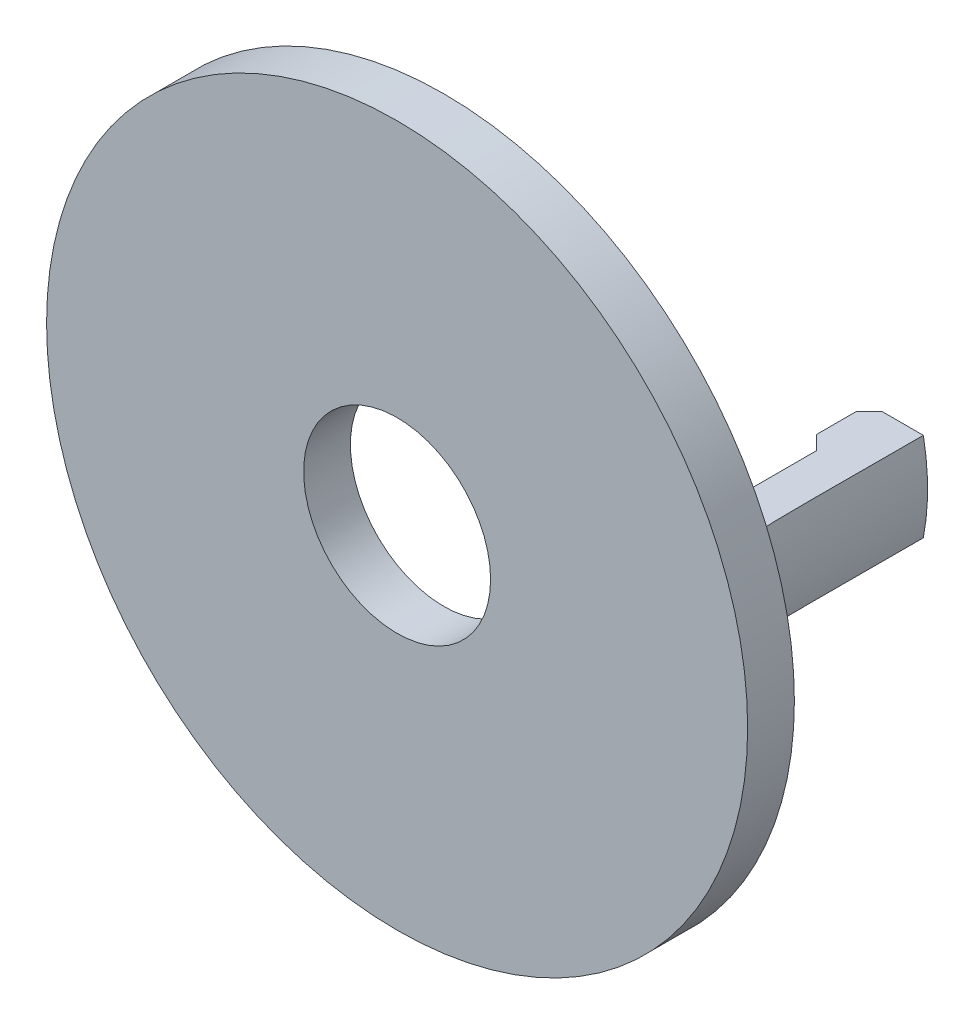
ISO-10303-21;
HEADER;
FILE_DESCRIPTION(('STEP AP214'),'2;1');
FILE_NAME('part.step','',(''),(''),'','','');
FILE_SCHEMA(('AUTOMOTIVE_DESIGN { 1 0 10303 214 1 1 1 1 }'));
ENDSEC;
DATA;
#1=APPLICATION_CONTEXT('core data for automotive mechanical design processes');
#2=APPLICATION_PROTOCOL_DEFINITION('international standard','automotive_design',2000,#1);
#3=PRODUCT_CONTEXT('',#1,'mechanical');
#4=PRODUCT('Part','Part','',(#3));
#5=PRODUCT_RELATED_PRODUCT_CATEGORY('part','',(#4));
#6=PRODUCT_DEFINITION_FORMATION('','',#4);
#7=PRODUCT_DEFINITION_CONTEXT('part definition',#1,'design');
#8=PRODUCT_DEFINITION('design','',#6,#7);
#9=PRODUCT_DEFINITION_SHAPE('','',#8);
#10=(LENGTH_UNIT() NAMED_UNIT(*) SI_UNIT(.MILLI.,.METRE.));
#11=(NAMED_UNIT(*) PLANE_ANGLE_UNIT() SI_UNIT($,.RADIAN.));
#12=(NAMED_UNIT(*) SI_UNIT($,.STERADIAN.) SOLID_ANGLE_UNIT());
#13=UNCERTAINTY_MEASURE_WITH_UNIT(LENGTH_MEASURE(1.E-05),#10,'distance_accuracy_value','');
#14=(GEOMETRIC_REPRESENTATION_CONTEXT(3) GLOBAL_UNCERTAINTY_ASSIGNED_CONTEXT((#13)) GLOBAL_UNIT_ASSIGNED_CONTEXT((#10,
#11,#12)) REPRESENTATION_CONTEXT('',''));
#15=CARTESIAN_POINT('',(0.,0.,0.));
#16=DIRECTION('',(0.,0.,1.));
#17=DIRECTION('',(1.,0.,0.));
#18=AXIS2_PLACEMENT_3D('',#15,#16,#17);
#19=CARTESIAN_POINT('',(0.,0.,0.));
#20=DIRECTION('',(0.,0.,1.));
#21=DIRECTION('',(1.,0.,0.));
#22=AXIS2_PLACEMENT_3D('',#19,#20,#21);
#23=PLANE('',#22);
#24=DIRECTION('',(-1.,0.,0.));
#25=VECTOR('',#24,1.);
#26=CARTESIAN_POINT('',(0.,4.75,0.));
#27=LINE('',#26,#25);
#28=CARTESIAN_POINT('',(-17.3535533905933,4.75,0.));
#29=VERTEX_POINT('',#28);
#30=CARTESIAN_POINT('',(-26.0708170182678,4.75,0.));
#31=VERTEX_POINT('',#30);
#32=EDGE_CURVE('E162',#29,#31,#27,.T.);
#33=ORIENTED_EDGE('',*,*,#32,.T.);
#34=CARTESIAN_POINT('',(0.,0.,0.));
#35=DIRECTION('',(0.,0.,-1.));
#36=DIRECTION('',(-1.,0.,0.));
#37=AXIS2_PLACEMENT_3D('',#34,#35,#36);
#38=CIRCLE('',#37,26.5);
#39=CARTESIAN_POINT('',(-26.0708170182678,-4.75,0.));
#40=VERTEX_POINT('',#39);
#41=EDGE_CURVE('E151',#40,#31,#38,.T.);
#42=ORIENTED_EDGE('',*,*,#41,.F.);
#43=DIRECTION('',(-1.,0.,0.));
#44=VECTOR('',#43,1.);
#45=CARTESIAN_POINT('',(0.,-4.75,0.));
#46=LINE('',#45,#44);
#47=CARTESIAN_POINT('',(-17.3535533905933,-4.75,0.));
#48=VERTEX_POINT('',#47);
#49=EDGE_CURVE('E195',#48,#40,#46,.T.);
#50=ORIENTED_EDGE('',*,*,#49,.F.);
#51=DIRECTION('',(0.,1.,0.));
#52=VECTOR('',#51,1.);
#53=CARTESIAN_POINT('',(-17.3535533905933,-4.75,0.));
#54=LINE('',#53,#52);
#55=EDGE_CURVE('E177',#48,#29,#54,.T.);
#56=ORIENTED_EDGE('',*,*,#55,.T.);
#57=EDGE_LOOP('',(#33,#42,#50,#56));
#58=FACE_BOUND('',#57,.T.);
#59=CARTESIAN_POINT('',(0.,0.,0.));
#60=DIRECTION('',(0.,0.,1.));
#61=DIRECTION('',(1.,0.,0.));
#62=AXIS2_PLACEMENT_3D('',#59,#60,#61);
#63=CIRCLE('',#62,26.5);
#64=CARTESIAN_POINT('',(26.0708170182678,-4.75,0.));
#65=VERTEX_POINT('',#64);
#66=CARTESIAN_POINT('',(26.0708170182678,4.74999999999999,0.));
#67=VERTEX_POINT('',#66);
#68=EDGE_CURVE('E258',#65,#67,#63,.T.);
#69=ORIENTED_EDGE('',*,*,#68,.T.);
#70=DIRECTION('',(1.,0.,0.));
#71=VECTOR('',#70,1.);
#72=CARTESIAN_POINT('',(0.,4.75,0.));
#73=LINE('',#72,#71);
#74=CARTESIAN_POINT('',(17.3535533905933,4.75,0.));
#75=VERTEX_POINT('',#74);
#76=EDGE_CURVE('E560',#75,#67,#73,.T.);
#77=ORIENTED_EDGE('',*,*,#76,.F.);
#78=DIRECTION('',(0.,1.,0.));
#79=VECTOR('',#78,1.);
#80=CARTESIAN_POINT('',(17.3535533905933,-4.75,0.));
#81=LINE('',#80,#79);
#82=CARTESIAN_POINT('',(17.3535533905933,-4.75,0.));
#83=VERTEX_POINT('',#82);
#84=EDGE_CURVE('E517',#83,#75,#81,.T.);
#85=ORIENTED_EDGE('',*,*,#84,.F.);
#86=DIRECTION('',(1.,0.,0.));
#87=VECTOR('',#86,1.);
#88=CARTESIAN_POINT('',(0.,-4.75,0.));
#89=LINE('',#88,#87);
#90=EDGE_CURVE('E58',#83,#65,#89,.T.);
#91=ORIENTED_EDGE('',*,*,#90,.T.);
#92=EDGE_LOOP('',(#69,#77,#85,#91));
#93=FACE_BOUND('',#92,.T.);
#94=CARTESIAN_POINT('',(0.,0.,0.));
#95=DIRECTION('',(0.,0.,1.));
#96=DIRECTION('',(1.,0.,0.));
#97=AXIS2_PLACEMENT_3D('',#94,#95,#96);
#98=CIRCLE('',#97,37.5);
#99=CARTESIAN_POINT('',(37.5,0.,0.));
#100=VERTEX_POINT('',#99);
#101=EDGE_CURVE('E39',#100,#100,#98,.T.);
#102=ORIENTED_EDGE('',*,*,#101,.F.);
#103=EDGE_LOOP('',(#102));
#104=FACE_BOUND('',#103,.T.);
#105=CARTESIAN_POINT('',(0.,0.,0.));
#106=DIRECTION('',(0.,0.,1.));
#107=DIRECTION('',(1.,0.,0.));
#108=AXIS2_PLACEMENT_3D('',#105,#106,#107);
#109=CIRCLE('',#108,10.);
#110=CARTESIAN_POINT('',(10.,0.,0.));
#111=VERTEX_POINT('',#110);
#112=EDGE_CURVE('E510',#111,#111,#109,.T.);
#113=ORIENTED_EDGE('',*,*,#112,.T.);
#114=EDGE_LOOP('',(#113));
#115=FACE_BOUND('',#114,.T.);
#116=ADVANCED_FACE('F35',(#58,#93,#104,#115),#23,.F.);
#117=CARTESIAN_POINT('',(0.,-4.75,-26.75));
#118=DIRECTION('',(0.,0.,1.));
#119=DIRECTION('',(1.,0.,0.));
#120=AXIS2_PLACEMENT_3D('',#117,#118,#119);
#121=PLANE('',#120);
#122=DIRECTION('',(1.,0.,0.));
#123=VECTOR('',#122,1.);
#124=CARTESIAN_POINT('',(0.,4.75,-26.75));
#125=LINE('',#124,#123);
#126=CARTESIAN_POINT('',(20.1035533905932,4.75,-26.75));
#127=VERTEX_POINT('',#126);
#128=CARTESIAN_POINT('',(24.5446022579304,4.75,-26.75));
#129=VERTEX_POINT('',#128);
#130=EDGE_CURVE('E558',#127,#129,#125,.T.);
#131=ORIENTED_EDGE('',*,*,#130,.T.);
#132=CARTESIAN_POINT('',(0.,0.,-26.75));
#133=DIRECTION('',(0.,0.,1.));
#134=DIRECTION('',(1.,0.,0.));
#135=AXIS2_PLACEMENT_3D('',#132,#133,#134);
#136=CIRCLE('',#135,25.);
#137=CARTESIAN_POINT('',(24.5446022579304,-4.75,-26.75));
#138=VERTEX_POINT('',#137);
#139=EDGE_CURVE('E215',#138,#129,#136,.T.);
#140=ORIENTED_EDGE('',*,*,#139,.F.);
#141=DIRECTION('',(1.,0.,0.));
#142=VECTOR('',#141,1.);
#143=CARTESIAN_POINT('',(0.,-4.75,-26.75));
#144=LINE('',#143,#142);
#145=CARTESIAN_POINT('',(20.1035533905932,-4.75,-26.75));
#146=VERTEX_POINT('',#145);
#147=EDGE_CURVE('E542',#146,#138,#144,.T.);
#148=ORIENTED_EDGE('',*,*,#147,.F.);
#149=DIRECTION('',(0.,1.,0.));
#150=VECTOR('',#149,1.);
#151=CARTESIAN_POINT('',(20.1035533905932,-4.75,-26.75));
#152=LINE('',#151,#150);
#153=EDGE_CURVE('E520',#146,#127,#152,.T.);
#154=ORIENTED_EDGE('',*,*,#153,.T.);
#155=EDGE_LOOP('',(#131,#140,#148,#154));
#156=FACE_BOUND('',#155,.T.);
#157=ADVANCED_FACE('F264',(#156),#121,.F.);
#158=CARTESIAN_POINT('',(0.,-4.75,0.));
#159=DIRECTION('',(0.,1.,0.));
#160=DIRECTION('',(0.,0.,1.));
#161=AXIS2_PLACEMENT_3D('',#158,#159,#160);
#162=PLANE('',#161);
#163=ORIENTED_EDGE('',*,*,#147,.T.);
#164=CARTESIAN_POINT('',(24.5446022579304,-4.75,-26.75));
#165=CARTESIAN_POINT('',(24.544602843975,-4.75,-26.4900341603113));
#166=CARTESIAN_POINT('',(24.544567738296,-4.75,-26.230068320774));
#167=CARTESIAN_POINT('',(24.5444272827779,-4.75,-25.7101392829999));
#168=CARTESIAN_POINT('',(24.5443219336473,-4.75,-25.450176084763));
#169=CARTESIAN_POINT('',(24.5440421314134,-4.75,-24.9302514630246));
#170=CARTESIAN_POINT('',(24.5438676787719,-4.75,-24.670290039523));
#171=CARTESIAN_POINT('',(24.543457763498,-4.75,-24.1503680978194));
#172=CARTESIAN_POINT('',(24.5432223010666,-4.75,-23.8904075796173));
#173=CARTESIAN_POINT('',(24.5427082569573,-4.75,-23.3700744240048));
#174=CARTESIAN_POINT('',(24.5424296075065,-4.75,-23.1097017866637));
#175=CARTESIAN_POINT('',(24.5418645091987,-4.75,-22.588955638568));
#176=CARTESIAN_POINT('',(24.5415780603153,-4.75,-22.3285821278135));
#177=CARTESIAN_POINT('',(24.5410551724295,-4.75,-21.8078332982893));
#178=CARTESIAN_POINT('',(24.540818733764,-4.75,-21.5474579795194));
#179=CARTESIAN_POINT('',(24.5404770596444,-4.75,-21.0267045655946));
#180=CARTESIAN_POINT('',(24.5403718255365,-4.74999999999998,-20.7663264704388));
#181=CARTESIAN_POINT('',(24.5403827011997,-4.74999999999998,-20.2921093641617));
#182=CARTESIAN_POINT('',(24.540462610612,-4.75,-20.0782703541969));
#183=CARTESIAN_POINT('',(24.5408122701692,-4.75,-19.6505925976213));
#184=CARTESIAN_POINT('',(24.5410820202008,-4.75,-19.4367538510105));
#185=CARTESIAN_POINT('',(24.5418417259242,-4.75,-19.0090756709439));
#186=CARTESIAN_POINT('',(24.5423316827528,-4.75,-18.7952362374905));
#187=CARTESIAN_POINT('',(24.5435091114824,-4.75,-18.367557776966));
#188=CARTESIAN_POINT('',(24.5441965834262,-4.75,-18.1537187498952));
#189=CARTESIAN_POINT('',(24.5447433385926,-4.75,-17.7260458448049));
#190=CARTESIAN_POINT('',(24.5446026487313,-4.75,-17.5122119668441));
#191=CARTESIAN_POINT('',(24.5432181811213,-4.75,-17.0845480504823));
#192=CARTESIAN_POINT('',(24.5419744051455,-4.75,-16.8707180120757));
#193=CARTESIAN_POINT('',(24.5385926160383,-4.75,-16.4430719101435));
#194=CARTESIAN_POINT('',(24.5364546285832,-4.75,-16.229255846393));
#195=CARTESIAN_POINT('',(24.5322168100033,-4.75,-15.8016230692496));
#196=CARTESIAN_POINT('',(24.53011697896,-4.75,-15.5878063558565));
#197=CARTESIAN_POINT('',(24.5263645823622,-4.75,-15.1606195264891));
#198=CARTESIAN_POINT('',(24.5247110830417,-4.75,-14.9472494194883));
#199=CARTESIAN_POINT('',(24.5221256512917,-4.75,-14.520504922544));
#200=CARTESIAN_POINT('',(24.5211937186468,-4.75,-14.3071305326019));
#201=CARTESIAN_POINT('',(24.5197798800899,-4.75,-13.667026115572));
#202=CARTESIAN_POINT('',(24.5206796762454,-4.75,-13.2402911130625));
#203=CARTESIAN_POINT('',(24.5273281003118,-4.75,-12.3867995612668));
#204=CARTESIAN_POINT('',(24.5330773616785,-4.75,-11.960043016449));
#205=CARTESIAN_POINT('',(24.5503909789403,-4.75,-11.1064714788339));
#206=CARTESIAN_POINT('',(24.5619576775498,-4.75,-10.6796565317991));
#207=CARTESIAN_POINT('',(24.5920511369746,-4.75,-9.8217942813045));
#208=CARTESIAN_POINT('',(24.6106494671964,-4.75,-9.39074942876436));
#209=CARTESIAN_POINT('',(24.655937004658,-4.75,-8.52905607120454));
#210=CARTESIAN_POINT('',(24.6826266043756,-4.75,-8.09840758642781));
#211=CARTESIAN_POINT('',(24.7454520065399,-4.75,-7.23801248754643));
#212=CARTESIAN_POINT('',(24.78158293482,-4.75,-6.8082655230862));
#213=CARTESIAN_POINT('',(24.8649761665417,-4.75,-5.95019636521333));
#214=CARTESIAN_POINT('',(24.9122291480071,-4.75,-5.52187328161538));
#215=CARTESIAN_POINT('',(25.0205290435248,-4.75,-4.66351214197102));
#216=CARTESIAN_POINT('',(25.0816821003508,-4.75,-4.23348731570197));
#217=CARTESIAN_POINT('',(25.2206099430375,-4.75,-3.37602471739465));
#218=CARTESIAN_POINT('',(25.2983858450953,-4.75,-2.94858712106763));
#219=CARTESIAN_POINT('',(25.4308044571975,-4.75,-2.3103582139277));
#220=CARTESIAN_POINT('',(25.4776132097228,-4.75,-2.09793573414758));
#221=CARTESIAN_POINT('',(25.5772011585018,-4.75,-1.67451187758835));
#222=CARTESIAN_POINT('',(25.6299796639456,-4.75,-1.46351033936815));
#223=CARTESIAN_POINT('',(25.7426345668007,-4.75,-1.04230755213053));
#224=CARTESIAN_POINT('',(25.8025437977287,-4.75,-0.832114997255053));
#225=CARTESIAN_POINT('',(25.8983947104684,-4.75,-0.518615429746523));
#226=CARTESIAN_POINT('',(25.931350397074,-4.75,-0.414392120037368));
#227=CARTESIAN_POINT('',(25.9994223845563,-4.75,-0.206645148476857));
#228=CARTESIAN_POINT('',(26.0345388542266,-4.75,-0.103121541986968));
#229=CARTESIAN_POINT('',(26.0708170182678,-4.75,0.));
#230=B_SPLINE_CURVE_WITH_KNOTS('',3,(#164,#165,#166,#167,#168,#169,#170,#171,#172,#173,#174,
#175,#176,#177,#178,#179,#180,#181,#182,#183,#184,#185,#186,#187,#188,#189,#190,#191,#192,#193,
#194,#195,#196,#197,#198,#199,#200,#201,#202,#203,#204,#205,#206,#207,#208,#209,#210,#211,#212,
#213,#214,#215,#216,#217,#218,#219,#220,#221,#222,#223,#224,#225,#226,#227,#228,#229),
.UNSPECIFIED.,.F.,.F.,(4,2,2,2,2,2,2,2,2,2,2,2,2,2,2,2,2,2,2,2,2,2,2,2,2,2,2,2,2,2,2,2,4),(0.,
0.77989751633521,1.55978716554315,2.33967160318282,3.11955347215248,3.90067183045508,
4.68179283537858,5.46291910339946,6.24405338682444,6.88557039909865,7.52708702791261,
8.16860696848386,8.81012704795665,9.45162627754787,10.0931244760507,10.734604255907,
11.3760854039313,12.0162139273369,12.6563422596758,13.9365277374641,15.2168804639246,
16.4977492089069,17.7920220730654,19.0863577276801,20.3800264861018,21.6726147899059,
22.9754264066862,24.2783255326434,24.930811621919,25.5832222836809,26.2387625026019,
26.5666701451266,26.8946034353666),.UNSPECIFIED.);
#231=EDGE_CURVE('E253',#138,#65,#230,.T.);
#232=ORIENTED_EDGE('',*,*,#231,.T.);
#233=ORIENTED_EDGE('',*,*,#90,.F.);
#234=DIRECTION('',(-0.707106781186548,0.,0.707106781186548));
#235=VECTOR('',#234,1.);
#236=CARTESIAN_POINT('',(8.67677669529664,-4.75,8.67677669529664));
#237=LINE('',#236,#235);
#238=CARTESIAN_POINT('',(20.25,-4.75,-2.89644660940673));
#239=VERTEX_POINT('',#238);
#240=EDGE_CURVE('E523',#239,#83,#237,.T.);
#241=ORIENTED_EDGE('',*,*,#240,.F.);
#242=DIRECTION('',(0.,0.,1.));
#243=VECTOR('',#242,1.);
#244=CARTESIAN_POINT('',(20.25,-4.75,0.));
#245=LINE('',#244,#243);
#246=CARTESIAN_POINT('',(20.25,-4.75,-19.6035533905933));
#247=VERTEX_POINT('',#246);
#248=EDGE_CURVE('E533',#247,#239,#245,.T.);
#249=ORIENTED_EDGE('',*,*,#248,.F.);
#250=DIRECTION('',(-0.707106781186565,0.,-0.70710678118653));
#251=VECTOR('',#250,1.);
#252=CARTESIAN_POINT('',(19.9267766952962,-4.75,-19.9267766952971));
#253=LINE('',#252,#251);
#254=CARTESIAN_POINT('',(18.75,-4.75,-21.1035533905932));
#255=VERTEX_POINT('',#254);
#256=EDGE_CURVE('E536',#247,#255,#253,.T.);
#257=ORIENTED_EDGE('',*,*,#256,.T.);
#258=DIRECTION('',(0.,0.,-1.));
#259=VECTOR('',#258,1.);
#260=CARTESIAN_POINT('',(18.75,-4.75,0.));
#261=LINE('',#260,#259);
#262=CARTESIAN_POINT('',(18.75,-4.75,-25.3964466094067));
#263=VERTEX_POINT('',#262);
#264=EDGE_CURVE('E538',#255,#263,#261,.T.);
#265=ORIENTED_EDGE('',*,*,#264,.T.);
#266=DIRECTION('',(0.70710678118653,0.,-0.707106781186565));
#267=VECTOR('',#266,1.);
#268=CARTESIAN_POINT('',(-3.32322330470291,-4.75,-3.32322330470275));
#269=LINE('',#268,#267);
#270=EDGE_CURVE('E540',#263,#146,#269,.T.);
#271=ORIENTED_EDGE('',*,*,#270,.T.);
#272=EDGE_LOOP('',(#163,#232,#233,#241,#249,#257,#265,#271));
#273=FACE_BOUND('',#272,.T.);
#274=ADVANCED_FACE('F260',(#273),#162,.F.);
#275=CARTESIAN_POINT('',(0.,4.75,0.));
#276=DIRECTION('',(0.,1.,0.));
#277=DIRECTION('',(0.,0.,1.));
#278=AXIS2_PLACEMENT_3D('',#275,#276,#277);
#279=PLANE('',#278);
#280=CARTESIAN_POINT('',(24.5446022579304,4.75,-26.75));
#281=CARTESIAN_POINT('',(24.544602843975,4.75,-26.4900341603113));
#282=CARTESIAN_POINT('',(24.544567738296,4.75,-26.230068320774));
#283=CARTESIAN_POINT('',(24.5444272827779,4.75,-25.7101392829999));
#284=CARTESIAN_POINT('',(24.5443219336473,4.75,-25.450176084763));
#285=CARTESIAN_POINT('',(24.5440421314134,4.75,-24.9302514630246));
#286=CARTESIAN_POINT('',(24.5438676787719,4.75,-24.670290039523));
#287=CARTESIAN_POINT('',(24.543457763498,4.75,-24.1503680978194));
#288=CARTESIAN_POINT('',(24.5432223010666,4.75,-23.8904075796173));
#289=CARTESIAN_POINT('',(24.5427082569573,4.75,-23.3700744240048));
#290=CARTESIAN_POINT('',(24.5424296075065,4.75,-23.1097017866637));
#291=CARTESIAN_POINT('',(24.5418645091987,4.75,-22.588955638568));
#292=CARTESIAN_POINT('',(24.5415780603153,4.75,-22.3285821278135));
#293=CARTESIAN_POINT('',(24.5410551724295,4.75,-21.8078332982893));
#294=CARTESIAN_POINT('',(24.540818733764,4.75,-21.5474579795194));
#295=CARTESIAN_POINT('',(24.5404770596444,4.75,-21.0267045655946));
#296=CARTESIAN_POINT('',(24.5403718255365,4.75,-20.7663264704388));
#297=CARTESIAN_POINT('',(24.5403827011997,4.75,-20.2921093641617));
#298=CARTESIAN_POINT('',(24.540462610612,4.75,-20.0782703541969));
#299=CARTESIAN_POINT('',(24.5408122701692,4.75,-19.6505925976213));
#300=CARTESIAN_POINT('',(24.5410820202008,4.75,-19.4367538510105));
#301=CARTESIAN_POINT('',(24.5418417259242,4.75,-19.0090756709439));
#302=CARTESIAN_POINT('',(24.5423316827528,4.75,-18.7952362374905));
#303=CARTESIAN_POINT('',(24.5435091114824,4.75,-18.367557776966));
#304=CARTESIAN_POINT('',(24.5441965834262,4.75,-18.1537187498952));
#305=CARTESIAN_POINT('',(24.5447433385926,4.75,-17.7260458448049));
#306=CARTESIAN_POINT('',(24.5446026487313,4.75,-17.5122119668441));
#307=CARTESIAN_POINT('',(24.5432181811213,4.75,-17.0845480504823));
#308=CARTESIAN_POINT('',(24.5419744051455,4.75,-16.8707180120757));
#309=CARTESIAN_POINT('',(24.5385926160383,4.75,-16.4430719101435));
#310=CARTESIAN_POINT('',(24.5364546285832,4.75,-16.229255846393));
#311=CARTESIAN_POINT('',(24.5322168100033,4.75,-15.8016230692496));
#312=CARTESIAN_POINT('',(24.53011697896,4.75,-15.5878063558565));
#313=CARTESIAN_POINT('',(24.5263645823622,4.75,-15.1606195264891));
#314=CARTESIAN_POINT('',(24.5247110830417,4.75,-14.9472494194883));
#315=CARTESIAN_POINT('',(24.5221256512917,4.75,-14.520504922544));
#316=CARTESIAN_POINT('',(24.5211937186468,4.75,-14.3071305326019));
#317=CARTESIAN_POINT('',(24.5197798800899,4.75,-13.667026115572));
#318=CARTESIAN_POINT('',(24.5206796762454,4.75,-13.2402911130625));
#319=CARTESIAN_POINT('',(24.5273281003118,4.75,-12.3867995612668));
#320=CARTESIAN_POINT('',(24.5330773616785,4.75,-11.960043016449));
#321=CARTESIAN_POINT('',(24.5503909789403,4.75,-11.1064714788339));
#322=CARTESIAN_POINT('',(24.5619576775498,4.75,-10.6796565317991));
#323=CARTESIAN_POINT('',(24.5920511369746,4.75,-9.8217942813045));
#324=CARTESIAN_POINT('',(24.6106494671964,4.75,-9.39074942876436));
#325=CARTESIAN_POINT('',(24.655937004658,4.75,-8.52905607120454));
#326=CARTESIAN_POINT('',(24.6826266043756,4.75,-8.09840758642781));
#327=CARTESIAN_POINT('',(24.7454520065399,4.75,-7.23801248754643));
#328=CARTESIAN_POINT('',(24.78158293482,4.75,-6.8082655230862));
#329=CARTESIAN_POINT('',(24.8649761665417,4.75,-5.95019636521333));
#330=CARTESIAN_POINT('',(24.9122291480071,4.75,-5.52187328161538));
#331=CARTESIAN_POINT('',(25.0205290435248,4.75,-4.66351214197102));
#332=CARTESIAN_POINT('',(25.0816821003508,4.75,-4.23348731570197));
#333=CARTESIAN_POINT('',(25.2206099430375,4.75,-3.37602471739465));
#334=CARTESIAN_POINT('',(25.2983858450953,4.75,-2.94858712106763));
#335=CARTESIAN_POINT('',(25.4308044571975,4.75,-2.3103582139277));
#336=CARTESIAN_POINT('',(25.4776132097228,4.75,-2.09793573414758));
#337=CARTESIAN_POINT('',(25.5772011585018,4.75,-1.67451187758835));
#338=CARTESIAN_POINT('',(25.6299796639456,4.75,-1.46351033936815));
#339=CARTESIAN_POINT('',(25.7426345668007,4.75,-1.04230755213053));
#340=CARTESIAN_POINT('',(25.8025437977287,4.75,-0.832114997255053));
#341=CARTESIAN_POINT('',(25.8983947104684,4.75,-0.518615429746523));
#342=CARTESIAN_POINT('',(25.931350397074,4.75,-0.414392120037368));
#343=CARTESIAN_POINT('',(25.9994223845563,4.75,-0.206645148476857));
#344=CARTESIAN_POINT('',(26.0345388542266,4.75,-0.103121541986968));
#345=CARTESIAN_POINT('',(26.0708170182678,4.75,0.));
#346=B_SPLINE_CURVE_WITH_KNOTS('',3,(#280,#281,#282,#283,#284,#285,#286,#287,#288,#289,#290,
#291,#292,#293,#294,#295,#296,#297,#298,#299,#300,#301,#302,#303,#304,#305,#306,#307,#308,#309,
#310,#311,#312,#313,#314,#315,#316,#317,#318,#319,#320,#321,#322,#323,#324,#325,#326,#327,#328,
#329,#330,#331,#332,#333,#334,#335,#336,#337,#338,#339,#340,#341,#342,#343,#344,#345),
.UNSPECIFIED.,.F.,.F.,(4,2,2,2,2,2,2,2,2,2,2,2,2,2,2,2,2,2,2,2,2,2,2,2,2,2,2,2,2,2,2,2,4),(0.,
0.77989751633521,1.55978716554315,2.33967160318282,3.11955347215248,3.90067183045508,
4.68179283537858,5.46291910339946,6.24405338682444,6.88557039909865,7.52708702791261,
8.16860696848386,8.81012704795665,9.45162627754787,10.0931244760507,10.734604255907,
11.3760854039313,12.0162139273369,12.6563422596758,13.9365277374641,15.2168804639246,
16.4977492089069,17.7920220730654,19.0863577276801,20.3800264861018,21.6726147899059,
22.9754264066862,24.2783255326434,24.930811621919,25.5832222836809,26.2387625026019,
26.5666701451266,26.8946034353666),.UNSPECIFIED.);
#347=EDGE_CURVE('E248',#129,#67,#346,.T.);
#348=ORIENTED_EDGE('',*,*,#347,.F.);
#349=ORIENTED_EDGE('',*,*,#130,.F.);
#350=DIRECTION('',(0.70710678118653,0.,-0.707106781186565));
#351=VECTOR('',#350,1.);
#352=CARTESIAN_POINT('',(-3.32322330470291,4.75,-3.32322330470275));
#353=LINE('',#352,#351);
#354=CARTESIAN_POINT('',(18.75,4.75,-25.3964466094067));
#355=VERTEX_POINT('',#354);
#356=EDGE_CURVE('E555',#355,#127,#353,.T.);
#357=ORIENTED_EDGE('',*,*,#356,.F.);
#358=DIRECTION('',(0.,0.,-1.));
#359=VECTOR('',#358,1.);
#360=CARTESIAN_POINT('',(18.75,4.75,0.));
#361=LINE('',#360,#359);
#362=CARTESIAN_POINT('',(18.75,4.75,-21.1035533905932));
#363=VERTEX_POINT('',#362);
#364=EDGE_CURVE('E552',#363,#355,#361,.T.);
#365=ORIENTED_EDGE('',*,*,#364,.F.);
#366=DIRECTION('',(-0.707106781186565,0.,-0.70710678118653));
#367=VECTOR('',#366,1.);
#368=CARTESIAN_POINT('',(19.9267766952962,4.75,-19.9267766952971));
#369=LINE('',#368,#367);
#370=CARTESIAN_POINT('',(20.25,4.75,-19.6035533905933));
#371=VERTEX_POINT('',#370);
#372=EDGE_CURVE('E549',#371,#363,#369,.T.);
#373=ORIENTED_EDGE('',*,*,#372,.F.);
#374=DIRECTION('',(0.,0.,1.));
#375=VECTOR('',#374,1.);
#376=CARTESIAN_POINT('',(20.25,4.75,0.));
#377=LINE('',#376,#375);
#378=CARTESIAN_POINT('',(20.25,4.75,-2.89644660940673));
#379=VERTEX_POINT('',#378);
#380=EDGE_CURVE('E547',#371,#379,#377,.T.);
#381=ORIENTED_EDGE('',*,*,#380,.T.);
#382=DIRECTION('',(-0.707106781186548,0.,0.707106781186548));
#383=VECTOR('',#382,1.);
#384=CARTESIAN_POINT('',(8.67677669529664,4.75,8.67677669529664));
#385=LINE('',#384,#383);
#386=EDGE_CURVE('E50',#379,#75,#385,.T.);
#387=ORIENTED_EDGE('',*,*,#386,.T.);
#388=ORIENTED_EDGE('',*,*,#76,.T.);
#389=EDGE_LOOP('',(#348,#349,#357,#365,#373,#381,#387,#388));
#390=FACE_BOUND('',#389,.T.);
#391=ADVANCED_FACE('F244',(#390),#279,.T.);
#392=CARTESIAN_POINT('',(0.,0.,5.));
#393=DIRECTION('',(0.,0.,-1.));
#394=DIRECTION('',(-1.,0.,0.));
#395=AXIS2_PLACEMENT_3D('',#392,#393,#394);
#396=CYLINDRICAL_SURFACE('',#395,37.5);
#397=CARTESIAN_POINT('',(0.,0.,5.));
#398=DIRECTION('',(0.,0.,1.));
#399=DIRECTION('',(1.,0.,0.));
#400=AXIS2_PLACEMENT_3D('',#397,#398,#399);
#401=CIRCLE('',#400,37.5);
#402=CARTESIAN_POINT('',(37.5,0.,5.));
#403=VERTEX_POINT('',#402);
#404=EDGE_CURVE('E11',#403,#403,#401,.T.);
#405=ORIENTED_EDGE('',*,*,#404,.F.);
#406=EDGE_LOOP('',(#405));
#407=FACE_BOUND('',#406,.T.);
#408=ORIENTED_EDGE('',*,*,#101,.T.);
#409=EDGE_LOOP('',(#408));
#410=FACE_BOUND('',#409,.T.);
#411=ADVANCED_FACE('F37',(#407,#410),#396,.T.);
#412=CARTESIAN_POINT('',(0.,0.,5.));
#413=DIRECTION('',(0.,0.,1.));
#414=DIRECTION('',(1.,0.,0.));
#415=AXIS2_PLACEMENT_3D('',#412,#413,#414);
#416=PLANE('',#415);
#417=CARTESIAN_POINT('',(0.,0.,5.));
#418=DIRECTION('',(0.,0.,1.));
#419=DIRECTION('',(1.,0.,0.));
#420=AXIS2_PLACEMENT_3D('',#417,#418,#419);
#421=CIRCLE('',#420,10.);
#422=CARTESIAN_POINT('',(10.,0.,5.));
#423=VERTEX_POINT('',#422);
#424=EDGE_CURVE('E512',#423,#423,#421,.T.);
#425=ORIENTED_EDGE('',*,*,#424,.F.);
#426=EDGE_LOOP('',(#425));
#427=FACE_BOUND('',#426,.T.);
#428=ORIENTED_EDGE('',*,*,#404,.T.);
#429=EDGE_LOOP('',(#428));
#430=FACE_BOUND('',#429,.T.);
#431=ADVANCED_FACE('F290',(#427,#430),#416,.T.);
#432=CARTESIAN_POINT('',(0.,0.,0.));
#433=DIRECTION('',(0.,0.,1.));
#434=DIRECTION('',(1.,0.,0.));
#435=AXIS2_PLACEMENT_3D('',#432,#433,#434);
#436=CYLINDRICAL_SURFACE('',#435,10.);
#437=ORIENTED_EDGE('',*,*,#112,.F.);
#438=EDGE_LOOP('',(#437));
#439=FACE_BOUND('',#438,.T.);
#440=ORIENTED_EDGE('',*,*,#424,.T.);
#441=EDGE_LOOP('',(#440));
#442=FACE_BOUND('',#441,.T.);
#443=ADVANCED_FACE('F269',(#439,#442),#436,.F.);
#444=CARTESIAN_POINT('',(8.67677669529664,-4.75,8.67677669529664));
#445=DIRECTION('',(-0.707106781186548,0.,-0.707106781186548));
#446=DIRECTION('',(-0.707106781186548,0.,0.707106781186548));
#447=AXIS2_PLACEMENT_3D('',#444,#445,#446);
#448=PLANE('',#447);
#449=ORIENTED_EDGE('',*,*,#84,.T.);
#450=ORIENTED_EDGE('',*,*,#386,.F.);
#451=DIRECTION('',(0.,1.,0.));
#452=VECTOR('',#451,1.);
#453=CARTESIAN_POINT('',(20.25,-4.75,-2.89644660940673));
#454=LINE('',#453,#452);
#455=EDGE_CURVE('E529',#239,#379,#454,.T.);
#456=ORIENTED_EDGE('',*,*,#455,.F.);
#457=ORIENTED_EDGE('',*,*,#240,.T.);
#458=EDGE_LOOP('',(#449,#450,#456,#457));
#459=FACE_BOUND('',#458,.T.);
#460=ADVANCED_FACE('F265',(#459),#448,.T.);
#461=CARTESIAN_POINT('',(20.25,-4.75,0.));
#462=DIRECTION('',(-1.,0.,0.));
#463=DIRECTION('',(0.,0.,1.));
#464=AXIS2_PLACEMENT_3D('',#461,#462,#463);
#465=PLANE('',#464);
#466=ORIENTED_EDGE('',*,*,#455,.T.);
#467=ORIENTED_EDGE('',*,*,#380,.F.);
#468=DIRECTION('',(0.,1.,0.));
#469=VECTOR('',#468,1.);
#470=CARTESIAN_POINT('',(20.25,-4.75,-19.6035533905933));
#471=LINE('',#470,#469);
#472=EDGE_CURVE('E527',#247,#371,#471,.T.);
#473=ORIENTED_EDGE('',*,*,#472,.F.);
#474=ORIENTED_EDGE('',*,*,#248,.T.);
#475=EDGE_LOOP('',(#466,#467,#473,#474));
#476=FACE_BOUND('',#475,.T.);
#477=ADVANCED_FACE('F268',(#476),#465,.T.);
#478=CARTESIAN_POINT('',(19.9267766952962,-4.75,-19.9267766952971));
#479=DIRECTION('',(0.70710678118653,0.,-0.707106781186565));
#480=DIRECTION('',(-0.707106781186565,0.,-0.70710678118653));
#481=AXIS2_PLACEMENT_3D('',#478,#479,#480);
#482=PLANE('',#481);
#483=ORIENTED_EDGE('',*,*,#472,.T.);
#484=ORIENTED_EDGE('',*,*,#372,.T.);
#485=DIRECTION('',(0.,1.,0.));
#486=VECTOR('',#485,1.);
#487=CARTESIAN_POINT('',(18.75,-4.75,-21.1035533905932));
#488=LINE('',#487,#486);
#489=EDGE_CURVE('E525',#255,#363,#488,.T.);
#490=ORIENTED_EDGE('',*,*,#489,.F.);
#491=ORIENTED_EDGE('',*,*,#256,.F.);
#492=EDGE_LOOP('',(#483,#484,#490,#491));
#493=FACE_BOUND('',#492,.T.);
#494=ADVANCED_FACE('F273',(#493),#482,.F.);
#495=CARTESIAN_POINT('',(18.75,-4.75,0.));
#496=DIRECTION('',(1.,0.,0.));
#497=DIRECTION('',(0.,0.,-1.));
#498=AXIS2_PLACEMENT_3D('',#495,#496,#497);
#499=PLANE('',#498);
#500=ORIENTED_EDGE('',*,*,#489,.T.);
#501=ORIENTED_EDGE('',*,*,#364,.T.);
#502=DIRECTION('',(0.,1.,0.));
#503=VECTOR('',#502,1.);
#504=CARTESIAN_POINT('',(18.75,-4.75,-25.3964466094067));
#505=LINE('',#504,#503);
#506=EDGE_CURVE('E522',#263,#355,#505,.T.);
#507=ORIENTED_EDGE('',*,*,#506,.F.);
#508=ORIENTED_EDGE('',*,*,#264,.F.);
#509=EDGE_LOOP('',(#500,#501,#507,#508));
#510=FACE_BOUND('',#509,.T.);
#511=ADVANCED_FACE('F277',(#510),#499,.F.);
#512=CARTESIAN_POINT('',(-3.32322330470291,-4.75,-3.32322330470275));
#513=DIRECTION('',(0.707106781186565,0.,0.70710678118653));
#514=DIRECTION('',(0.70710678118653,0.,-0.707106781186565));
#515=AXIS2_PLACEMENT_3D('',#512,#513,#514);
#516=PLANE('',#515);
#517=ORIENTED_EDGE('',*,*,#506,.T.);
#518=ORIENTED_EDGE('',*,*,#356,.T.);
#519=ORIENTED_EDGE('',*,*,#153,.F.);
#520=ORIENTED_EDGE('',*,*,#270,.F.);
#521=EDGE_LOOP('',(#517,#518,#519,#520));
#522=FACE_BOUND('',#521,.T.);
#523=ADVANCED_FACE('F240',(#522),#516,.F.);
#524=CARTESIAN_POINT('',(25.,0.,-26.75));
#525=CARTESIAN_POINT('',(25.,0.,-22.7281899199239));
#526=CARTESIAN_POINT('',(24.9900501784019,0.,-20.5424678539376));
#527=CARTESIAN_POINT('',(25.0119490800921,0.,-14.9423577277051));
#528=CARTESIAN_POINT('',(24.7748714714223,0.,-4.98393550611474));
#529=CARTESIAN_POINT('',(26.5,0.,0.));
#530=B_SPLINE_CURVE_WITH_KNOTS('',3,(#524,#525,#526,#527,#528,#529),.UNSPECIFIED.,.F.,.F.,(4,1,
1,4),(0.,0.446604720320574,0.546604720320574,1.),.UNSPECIFIED.);
#531=CARTESIAN_POINT('',(0.,0.,0.));
#532=DIRECTION('',(0.,0.,1.));
#533=AXIS1_PLACEMENT('',#531,#532);
#534=SURFACE_OF_REVOLUTION('',#530,#533);
#535=ORIENTED_EDGE('',*,*,#139,.T.);
#536=ORIENTED_EDGE('',*,*,#347,.T.);
#537=ORIENTED_EDGE('',*,*,#68,.F.);
#538=ORIENTED_EDGE('',*,*,#231,.F.);
#539=EDGE_LOOP('',(#535,#536,#537,#538));
#540=FACE_BOUND('',#539,.T.);
#541=ADVANCED_FACE('F234',(#540),#534,.T.);
#542=CARTESIAN_POINT('',(0.,-4.75,-26.75));
#543=DIRECTION('',(0.,0.,-1.));
#544=DIRECTION('',(-1.,0.,0.));
#545=AXIS2_PLACEMENT_3D('',#542,#543,#544);
#546=PLANE('',#545);
#547=CARTESIAN_POINT('',(0.,0.,-26.75));
#548=DIRECTION('',(0.,0.,-1.));
#549=DIRECTION('',(-1.,0.,0.));
#550=AXIS2_PLACEMENT_3D('',#547,#548,#549);
#551=CIRCLE('',#550,25.);
#552=CARTESIAN_POINT('',(-24.5446022579304,-4.75,-26.75));
#553=VERTEX_POINT('',#552);
#554=CARTESIAN_POINT('',(-24.5446022579304,4.75,-26.75));
#555=VERTEX_POINT('',#554);
#556=EDGE_CURVE('E172',#553,#555,#551,.T.);
#557=ORIENTED_EDGE('',*,*,#556,.T.);
#558=DIRECTION('',(-1.,0.,0.));
#559=VECTOR('',#558,1.);
#560=CARTESIAN_POINT('',(0.,4.75,-26.75));
#561=LINE('',#560,#559);
#562=CARTESIAN_POINT('',(-20.1035533905932,4.75,-26.75));
#563=VERTEX_POINT('',#562);
#564=EDGE_CURVE('E171',#563,#555,#561,.T.);
#565=ORIENTED_EDGE('',*,*,#564,.F.);
#566=DIRECTION('',(0.,1.,0.));
#567=VECTOR('',#566,1.);
#568=CARTESIAN_POINT('',(-20.1035533905932,-4.75,-26.75));
#569=LINE('',#568,#567);
#570=CARTESIAN_POINT('',(-20.1035533905932,-4.75,-26.75));
#571=VERTEX_POINT('',#570);
#572=EDGE_CURVE('E213',#571,#563,#569,.T.);
#573=ORIENTED_EDGE('',*,*,#572,.F.);
#574=DIRECTION('',(-1.,0.,0.));
#575=VECTOR('',#574,1.);
#576=CARTESIAN_POINT('',(0.,-4.75,-26.75));
#577=LINE('',#576,#575);
#578=EDGE_CURVE('E210',#571,#553,#577,.T.);
#579=ORIENTED_EDGE('',*,*,#578,.T.);
#580=EDGE_LOOP('',(#557,#565,#573,#579));
#581=FACE_BOUND('',#580,.T.);
#582=ADVANCED_FACE('F239',(#581),#546,.T.);
#583=CARTESIAN_POINT('',(3.32322330470291,-4.75,-3.32322330470275));
#584=DIRECTION('',(0.707106781186565,0.,-0.70710678118653));
#585=DIRECTION('',(-0.70710678118653,0.,-0.707106781186565));
#586=AXIS2_PLACEMENT_3D('',#583,#584,#585);
#587=PLANE('',#586);
#588=ORIENTED_EDGE('',*,*,#572,.T.);
#589=DIRECTION('',(-0.70710678118653,0.,-0.707106781186565));
#590=VECTOR('',#589,1.);
#591=CARTESIAN_POINT('',(3.32322330470291,4.75,-3.32322330470275));
#592=LINE('',#591,#590);
#593=CARTESIAN_POINT('',(-18.75,4.75,-25.3964466094067));
#594=VERTEX_POINT('',#593);
#595=EDGE_CURVE('E192',#594,#563,#592,.T.);
#596=ORIENTED_EDGE('',*,*,#595,.F.);
#597=DIRECTION('',(0.,1.,0.));
#598=VECTOR('',#597,1.);
#599=CARTESIAN_POINT('',(-18.75,-4.75,-25.3964466094067));
#600=LINE('',#599,#598);
#601=CARTESIAN_POINT('',(-18.75,-4.75,-25.3964466094067));
#602=VERTEX_POINT('',#601);
#603=EDGE_CURVE('E216',#602,#594,#600,.T.);
#604=ORIENTED_EDGE('',*,*,#603,.F.);
#605=DIRECTION('',(-0.70710678118653,0.,-0.707106781186565));
#606=VECTOR('',#605,1.);
#607=CARTESIAN_POINT('',(3.32322330470291,-4.75,-3.32322330470275));
#608=LINE('',#607,#606);
#609=EDGE_CURVE('E207',#602,#571,#608,.T.);
#610=ORIENTED_EDGE('',*,*,#609,.T.);
#611=EDGE_LOOP('',(#588,#596,#604,#610));
#612=FACE_BOUND('',#611,.T.);
#613=ADVANCED_FACE('F354',(#612),#587,.T.);
#614=CARTESIAN_POINT('',(-18.75,-4.75,0.));
#615=DIRECTION('',(1.,0.,0.));
#616=DIRECTION('',(0.,0.,-1.));
#617=AXIS2_PLACEMENT_3D('',#614,#615,#616);
#618=PLANE('',#617);
#619=ORIENTED_EDGE('',*,*,#603,.T.);
#620=DIRECTION('',(0.,0.,-1.));
#621=VECTOR('',#620,1.);
#622=CARTESIAN_POINT('',(-18.75,4.75,0.));
#623=LINE('',#622,#621);
#624=CARTESIAN_POINT('',(-18.75,4.75,-21.1035533905932));
#625=VERTEX_POINT('',#624);
#626=EDGE_CURVE('E189',#625,#594,#623,.T.);
#627=ORIENTED_EDGE('',*,*,#626,.F.);
#628=DIRECTION('',(0.,1.,0.));
#629=VECTOR('',#628,1.);
#630=CARTESIAN_POINT('',(-18.75,-4.75,-21.1035533905932));
#631=LINE('',#630,#629);
#632=CARTESIAN_POINT('',(-18.75,-4.75,-21.1035533905932));
#633=VERTEX_POINT('',#632);
#634=EDGE_CURVE('E218',#633,#625,#631,.T.);
#635=ORIENTED_EDGE('',*,*,#634,.F.);
#636=DIRECTION('',(0.,0.,-1.));
#637=VECTOR('',#636,1.);
#638=CARTESIAN_POINT('',(-18.75,-4.75,0.));
#639=LINE('',#638,#637);
#640=EDGE_CURVE('E204',#633,#602,#639,.T.);
#641=ORIENTED_EDGE('',*,*,#640,.T.);
#642=EDGE_LOOP('',(#619,#627,#635,#641));
#643=FACE_BOUND('',#642,.T.);
#644=ADVANCED_FACE('F362',(#643),#618,.T.);
#645=CARTESIAN_POINT('',(-19.9267766952962,-4.75,-19.9267766952971));
#646=DIRECTION('',(0.70710678118653,0.,0.707106781186565));
#647=DIRECTION('',(0.707106781186565,0.,-0.70710678118653));
#648=AXIS2_PLACEMENT_3D('',#645,#646,#647);
#649=PLANE('',#648);
#650=ORIENTED_EDGE('',*,*,#634,.T.);
#651=DIRECTION('',(0.707106781186565,0.,-0.70710678118653));
#652=VECTOR('',#651,1.);
#653=CARTESIAN_POINT('',(-19.9267766952962,4.75,-19.9267766952971));
#654=LINE('',#653,#652);
#655=CARTESIAN_POINT('',(-20.25,4.75,-19.6035533905933));
#656=VERTEX_POINT('',#655);
#657=EDGE_CURVE('E186',#656,#625,#654,.T.);
#658=ORIENTED_EDGE('',*,*,#657,.F.);
#659=DIRECTION('',(0.,1.,0.));
#660=VECTOR('',#659,1.);
#661=CARTESIAN_POINT('',(-20.25,-4.75,-19.6035533905933));
#662=LINE('',#661,#660);
#663=CARTESIAN_POINT('',(-20.25,-4.75,-19.6035533905933));
#664=VERTEX_POINT('',#663);
#665=EDGE_CURVE('E220',#664,#656,#662,.T.);
#666=ORIENTED_EDGE('',*,*,#665,.F.);
#667=DIRECTION('',(0.707106781186565,0.,-0.70710678118653));
#668=VECTOR('',#667,1.);
#669=CARTESIAN_POINT('',(-19.9267766952962,-4.75,-19.9267766952971));
#670=LINE('',#669,#668);
#671=EDGE_CURVE('E201',#664,#633,#670,.T.);
#672=ORIENTED_EDGE('',*,*,#671,.T.);
#673=EDGE_LOOP('',(#650,#658,#666,#672));
#674=FACE_BOUND('',#673,.T.);
#675=ADVANCED_FACE('F370',(#674),#649,.T.);
#676=CARTESIAN_POINT('',(-20.25,-4.75,0.));
#677=DIRECTION('',(-1.,0.,0.));
#678=DIRECTION('',(0.,0.,1.));
#679=AXIS2_PLACEMENT_3D('',#676,#677,#678);
#680=PLANE('',#679);
#681=ORIENTED_EDGE('',*,*,#665,.T.);
#682=DIRECTION('',(0.,0.,1.));
#683=VECTOR('',#682,1.);
#684=CARTESIAN_POINT('',(-20.25,4.75,0.));
#685=LINE('',#684,#683);
#686=CARTESIAN_POINT('',(-20.25,4.75,-2.89644660940673));
#687=VERTEX_POINT('',#686);
#688=EDGE_CURVE('E180',#656,#687,#685,.T.);
#689=ORIENTED_EDGE('',*,*,#688,.T.);
#690=DIRECTION('',(0.,1.,0.));
#691=VECTOR('',#690,1.);
#692=CARTESIAN_POINT('',(-20.25,-4.75,-2.89644660940673));
#693=LINE('',#692,#691);
#694=CARTESIAN_POINT('',(-20.25,-4.75,-2.89644660940673));
#695=VERTEX_POINT('',#694);
#696=EDGE_CURVE('E222',#695,#687,#693,.T.);
#697=ORIENTED_EDGE('',*,*,#696,.F.);
#698=DIRECTION('',(0.,0.,1.));
#699=VECTOR('',#698,1.);
#700=CARTESIAN_POINT('',(-20.25,-4.75,0.));
#701=LINE('',#700,#699);
#702=EDGE_CURVE('E199',#664,#695,#701,.T.);
#703=ORIENTED_EDGE('',*,*,#702,.F.);
#704=EDGE_LOOP('',(#681,#689,#697,#703));
#705=FACE_BOUND('',#704,.T.);
#706=ADVANCED_FACE('F378',(#705),#680,.F.);
#707=CARTESIAN_POINT('',(-8.67677669529664,-4.75,8.67677669529664));
#708=DIRECTION('',(-0.707106781186548,0.,0.707106781186548));
#709=DIRECTION('',(0.707106781186548,0.,0.707106781186548));
#710=AXIS2_PLACEMENT_3D('',#707,#708,#709);
#711=PLANE('',#710);
#712=ORIENTED_EDGE('',*,*,#696,.T.);
#713=DIRECTION('',(0.707106781186548,0.,0.707106781186548));
#714=VECTOR('',#713,1.);
#715=CARTESIAN_POINT('',(-8.67677669529664,4.75,8.67677669529664));
#716=LINE('',#715,#714);
#717=EDGE_CURVE('E178',#687,#29,#716,.T.);
#718=ORIENTED_EDGE('',*,*,#717,.T.);
#719=ORIENTED_EDGE('',*,*,#55,.F.);
#720=DIRECTION('',(0.707106781186548,0.,0.707106781186548));
#721=VECTOR('',#720,1.);
#722=CARTESIAN_POINT('',(-8.67677669529664,-4.75,8.67677669529664));
#723=LINE('',#722,#721);
#724=EDGE_CURVE('E197',#695,#48,#723,.T.);
#725=ORIENTED_EDGE('',*,*,#724,.F.);
#726=EDGE_LOOP('',(#712,#718,#719,#725));
#727=FACE_BOUND('',#726,.T.);
#728=ADVANCED_FACE('F242',(#727),#711,.F.);
#729=CARTESIAN_POINT('',(0.,-4.75,0.));
#730=DIRECTION('',(0.,1.,0.));
#731=DIRECTION('',(0.,0.,1.));
#732=AXIS2_PLACEMENT_3D('',#729,#730,#731);
#733=PLANE('',#732);
#734=ORIENTED_EDGE('',*,*,#49,.T.);
#735=CARTESIAN_POINT('',(-26.0708170182678,-4.75,0.));
#736=CARTESIAN_POINT('',(-26.0034497233171,-4.75,-0.191607386096321));
#737=CARTESIAN_POINT('',(-25.9400386593825,-4.75,-0.384560359034486));
#738=CARTESIAN_POINT('',(-25.8202265158977,-4.75,-0.772564384940261));
#739=CARTESIAN_POINT('',(-25.7638230343301,-4.75,-0.967614693947789));
#740=CARTESIAN_POINT('',(-25.6573196621473,-4.75,-1.35846784155987));
#741=CARTESIAN_POINT('',(-25.6071924442707,-4.75,-1.55426329925545));
#742=CARTESIAN_POINT('',(-25.5122424742472,-4.75,-1.94714915892916));
#743=CARTESIAN_POINT('',(-25.4674202427154,-4.75,-2.14423968600144));
#744=CARTESIAN_POINT('',(-25.3401277502158,-4.75,-2.73639690424799));
#745=CARTESIAN_POINT('',(-25.2646655245693,-4.75,-3.13297596400189));
#746=CARTESIAN_POINT('',(-25.1287934117979,-4.75,-3.92858432820552));
#747=CARTESIAN_POINT('',(-25.0683814846719,-4.75,-4.32761329306042));
#748=CARTESIAN_POINT('',(-24.960395316387,-4.75,-5.12409131382348));
#749=CARTESIAN_POINT('',(-24.9127209394377,-4.75,-5.52152693964523));
#750=CARTESIAN_POINT('',(-24.827587443765,-4.75,-6.31779223214651));
#751=CARTESIAN_POINT('',(-24.7901364353038,-4.75,-6.71662275285662));
#752=CARTESIAN_POINT('',(-24.7239663616005,-4.75,-7.51520715588763));
#753=CARTESIAN_POINT('',(-24.6952518530533,-4.75,-7.91496141085806));
#754=CARTESIAN_POINT('',(-24.645366768573,-4.75,-8.71494031866908));
#755=CARTESIAN_POINT('',(-24.6241963337394,-4.75,-9.1151649801674));
#756=CARTESIAN_POINT('',(-24.5849285596075,-4.75,-9.99337427446534));
#757=CARTESIAN_POINT('',(-24.5682185209234,-4.75,-10.4714202326161));
#758=CARTESIAN_POINT('',(-24.5426562416359,-4.75,-11.4275237154419));
#759=CARTESIAN_POINT('',(-24.5338008725947,-4.75,-11.905581159605));
#760=CARTESIAN_POINT('',(-24.5253874291643,-4.75,-12.6226982857019));
#761=CARTESIAN_POINT('',(-24.5233945328051,-4.75,-12.8617333356156));
#762=CARTESIAN_POINT('',(-24.5208519637538,-4.75,-13.3398114319865));
#763=CARTESIAN_POINT('',(-24.5203022916838,-4.75,-13.578854478447));
#764=CARTESIAN_POINT('',(-24.5204436752184,-4.75,-14.0575234715241));
#765=CARTESIAN_POINT('',(-24.521137764312,-4.75,-14.2971494159157));
#766=CARTESIAN_POINT('',(-24.5235225688306,-4.75,-14.7763960705448));
#767=CARTESIAN_POINT('',(-24.5252132845552,-4.75,-15.0160167807808));
#768=CARTESIAN_POINT('',(-24.5292304966274,-4.75,-15.4952745588239));
#769=CARTESIAN_POINT('',(-24.531557051798,-4.75,-15.7349116260927));
#770=CARTESIAN_POINT('',(-24.5363072160131,-4.75,-16.2141841409629));
#771=CARTESIAN_POINT('',(-24.538730824711,-4.75,-16.4538195885671));
#772=CARTESIAN_POINT('',(-24.542412521114,-4.75,-16.9331054136606));
#773=CARTESIAN_POINT('',(-24.5436705857632,-4.75,-17.1727557913515));
#774=CARTESIAN_POINT('',(-24.5447858907275,-4.75,-17.6520601794203));
#775=CARTESIAN_POINT('',(-24.5446431257442,-4.75,-17.8917141898086));
#776=CARTESIAN_POINT('',(-24.543753190348,-4.75,-18.3111591087837));
#777=CARTESIAN_POINT('',(-24.5431658957943,-4.75,-18.4909505660195));
#778=CARTESIAN_POINT('',(-24.5421906841289,-4.75,-18.8505338125718));
#779=CARTESIAN_POINT('',(-24.5418027666946,-4.75,-19.0303256018873));
#780=CARTESIAN_POINT('',(-24.541166517779,-4.75,-19.3899076974511));
#781=CARTESIAN_POINT('',(-24.5409181849822,-4.75,-19.5696980036974));
#782=CARTESIAN_POINT('',(-24.5405635071428,-4.75,-19.9292789183811));
#783=CARTESIAN_POINT('',(-24.5404571622226,-4.75,-20.1090695268186));
#784=CARTESIAN_POINT('',(-24.5403128780546,-4.75,-20.648439320276));
#785=CARTESIAN_POINT('',(-24.540449686171,-4.75,-21.0080185381549));
#786=CARTESIAN_POINT('',(-24.5409559530396,-4.75,-21.7271760027118));
#787=CARTESIAN_POINT('',(-24.5413254113114,-4.75,-22.0867542493902));
#788=CARTESIAN_POINT('',(-24.5420951850094,-4.75,-22.8049676328831));
#789=CARTESIAN_POINT('',(-24.5424954169641,-4.75,-23.1636027697871));
#790=CARTESIAN_POINT('',(-24.5432194617451,-4.75,-23.8808746183402));
#791=CARTESIAN_POINT('',(-24.5435432742532,-4.75,-24.2395113299896));
#792=CARTESIAN_POINT('',(-24.5440676300517,-4.75,-24.9567877937008));
#793=CARTESIAN_POINT('',(-24.5442681723291,-4.75,-25.3154275457634));
#794=CARTESIAN_POINT('',(-24.544536828517,-4.75,-26.0327115310842));
#795=CARTESIAN_POINT('',(-24.5446049407908,-4.75,-26.391355764343));
#796=CARTESIAN_POINT('',(-24.5446022579304,-4.75,-26.75));
#797=B_SPLINE_CURVE_WITH_KNOTS('',3,(#735,#736,#737,#738,#739,#740,#741,#742,#743,#744,#745,
#746,#747,#748,#749,#750,#751,#752,#753,#754,#755,#756,#757,#758,#759,#760,#761,#762,#763,#764,
#765,#766,#767,#768,#769,#770,#771,#772,#773,#774,#775,#776,#777,#778,#779,#780,#781,#782,#783,
#784,#785,#786,#787,#788,#789,#790,#791,#792,#793,#794,#795,#796),.UNSPECIFIED.,.F.,.F.,(4,2,2,
2,2,2,2,2,2,2,2,2,2,2,2,2,2,2,2,2,2,2,2,2,2,2,2,2,2,2,4),(0.,0.609210543100822,1.21821168510786,
1.82446146888779,2.43077069893276,3.64144618863524,4.8519574872664,6.05265199084563,
7.25429626291129,8.45656620621679,9.65885863483977,11.0937933586609,12.5281563051112,
13.2452828697902,13.9624097435803,14.6812880453486,15.4001665631856,16.1191116087509,
16.8380540874112,17.5570107872804,18.2759702063878,18.8153475621056,19.3547240450619,
19.8940954444575,20.4334673092327,21.5122048446394,22.5909401529268,23.6668462325839,
24.7427567908996,25.8186761906238,26.8946088868226),.UNSPECIFIED.);
#798=EDGE_CURVE('E157',#40,#553,#797,.T.);
#799=ORIENTED_EDGE('',*,*,#798,.T.);
#800=ORIENTED_EDGE('',*,*,#578,.F.);
#801=ORIENTED_EDGE('',*,*,#609,.F.);
#802=ORIENTED_EDGE('',*,*,#640,.F.);
#803=ORIENTED_EDGE('',*,*,#671,.F.);
#804=ORIENTED_EDGE('',*,*,#702,.T.);
#805=ORIENTED_EDGE('',*,*,#724,.T.);
#806=EDGE_LOOP('',(#734,#799,#800,#801,#802,#803,#804,#805));
#807=FACE_BOUND('',#806,.T.);
#808=ADVANCED_FACE('F392',(#807),#733,.F.);
#809=CARTESIAN_POINT('',(0.,4.75,0.));
#810=DIRECTION('',(0.,1.,0.));
#811=DIRECTION('',(0.,0.,1.));
#812=AXIS2_PLACEMENT_3D('',#809,#810,#811);
#813=PLANE('',#812);
#814=CARTESIAN_POINT('',(-26.0708170182678,4.75,0.));
#815=CARTESIAN_POINT('',(-26.0034497233171,4.75,-0.191607386096325));
#816=CARTESIAN_POINT('',(-25.9400386593825,4.75,-0.384560359034492));
#817=CARTESIAN_POINT('',(-25.8202265158977,4.75,-0.77256438494027));
#818=CARTESIAN_POINT('',(-25.7638230343301,4.75,-0.9676146939478));
#819=CARTESIAN_POINT('',(-25.6573196621473,4.75,-1.35846784155988));
#820=CARTESIAN_POINT('',(-25.6071924442707,4.75,-1.55426329925546));
#821=CARTESIAN_POINT('',(-25.5122424742472,4.75,-1.94714915892918));
#822=CARTESIAN_POINT('',(-25.4674202427154,4.75,-2.14423968600146));
#823=CARTESIAN_POINT('',(-25.3401277502158,4.75,-2.73639690424802));
#824=CARTESIAN_POINT('',(-25.2646655245693,4.75,-3.13297596400192));
#825=CARTESIAN_POINT('',(-25.1287934117979,4.75,-3.92858432820555));
#826=CARTESIAN_POINT('',(-25.0683814846719,4.75,-4.32761329306046));
#827=CARTESIAN_POINT('',(-24.960395316387,4.75,-5.12409131382352));
#828=CARTESIAN_POINT('',(-24.9127209394377,4.75,-5.52152693964528));
#829=CARTESIAN_POINT('',(-24.827587443765,4.75,-6.31779223214656));
#830=CARTESIAN_POINT('',(-24.7901364353038,4.75,-6.71662275285668));
#831=CARTESIAN_POINT('',(-24.7239663616005,4.75,-7.51520715588769));
#832=CARTESIAN_POINT('',(-24.6952518530533,4.75,-7.91496141085813));
#833=CARTESIAN_POINT('',(-24.645366768573,4.75,-8.71494031866915));
#834=CARTESIAN_POINT('',(-24.6241963337394,4.75,-9.11516498016747));
#835=CARTESIAN_POINT('',(-24.5849285596075,4.75,-9.99337427446541));
#836=CARTESIAN_POINT('',(-24.5682185209234,4.75,-10.4714202326161));
#837=CARTESIAN_POINT('',(-24.5426562416359,4.75,-11.4275237154419));
#838=CARTESIAN_POINT('',(-24.5338008725947,4.75,-11.9055811596051));
#839=CARTESIAN_POINT('',(-24.5253874291643,4.75,-12.6226982857019));
#840=CARTESIAN_POINT('',(-24.5233945328051,4.75,-12.8617333356156));
#841=CARTESIAN_POINT('',(-24.5208519637538,4.75,-13.3398114319865));
#842=CARTESIAN_POINT('',(-24.5203022916838,4.75,-13.5788544784471));
#843=CARTESIAN_POINT('',(-24.5204436752184,4.75,-14.0575234715242));
#844=CARTESIAN_POINT('',(-24.521137764312,4.75,-14.2971494159158));
#845=CARTESIAN_POINT('',(-24.5235225688306,4.75,-14.7763960705449));
#846=CARTESIAN_POINT('',(-24.5252132845552,4.75,-15.0160167807808));
#847=CARTESIAN_POINT('',(-24.5292304966274,4.75,-15.4952745588239));
#848=CARTESIAN_POINT('',(-24.531557051798,4.75,-15.7349116260927));
#849=CARTESIAN_POINT('',(-24.5363072160131,4.75,-16.2141841409629));
#850=CARTESIAN_POINT('',(-24.538730824711,4.75,-16.4538195885671));
#851=CARTESIAN_POINT('',(-24.542412521114,4.75,-16.9331054136606));
#852=CARTESIAN_POINT('',(-24.5436705857632,4.75,-17.1727557913515));
#853=CARTESIAN_POINT('',(-24.5447858907275,4.75,-17.6520601794204));
#854=CARTESIAN_POINT('',(-24.5446431257442,4.74999999999999,-17.8917141898086));
#855=CARTESIAN_POINT('',(-24.543753190348,4.74999999999999,-18.3111591087837));
#856=CARTESIAN_POINT('',(-24.5431658957943,4.75,-18.4909505660195));
#857=CARTESIAN_POINT('',(-24.5421906841289,4.75,-18.8505338125719));
#858=CARTESIAN_POINT('',(-24.5418027666946,4.75,-19.0303256018873));
#859=CARTESIAN_POINT('',(-24.541166517779,4.75,-19.3899076974511));
#860=CARTESIAN_POINT('',(-24.5409181849822,4.75,-19.5696980036974));
#861=CARTESIAN_POINT('',(-24.5405635071428,4.75,-19.9292789183811));
#862=CARTESIAN_POINT('',(-24.5404571622226,4.75,-20.1090695268186));
#863=CARTESIAN_POINT('',(-24.5403128780546,4.75,-20.648439320276));
#864=CARTESIAN_POINT('',(-24.540449686171,4.75,-21.008018538155));
#865=CARTESIAN_POINT('',(-24.5409559530396,4.75,-21.7271760027118));
#866=CARTESIAN_POINT('',(-24.5413254113114,4.75,-22.0867542493902));
#867=CARTESIAN_POINT('',(-24.5420951850094,4.75,-22.8049676328831));
#868=CARTESIAN_POINT('',(-24.5424954169641,4.75,-23.1636027697871));
#869=CARTESIAN_POINT('',(-24.5432194617451,4.75,-23.8808746183402));
#870=CARTESIAN_POINT('',(-24.5435432742532,4.75,-24.2395113299896));
#871=CARTESIAN_POINT('',(-24.5440676300517,4.75,-24.9567877937008));
#872=CARTESIAN_POINT('',(-24.5442681723291,4.75,-25.3154275457634));
#873=CARTESIAN_POINT('',(-24.544536828517,4.75,-26.0327115310842));
#874=CARTESIAN_POINT('',(-24.5446049407908,4.75,-26.391355764343));
#875=CARTESIAN_POINT('',(-24.5446022579304,4.75000000000001,-26.75));
#876=B_SPLINE_CURVE_WITH_KNOTS('',3,(#814,#815,#816,#817,#818,#819,#820,#821,#822,#823,#824,
#825,#826,#827,#828,#829,#830,#831,#832,#833,#834,#835,#836,#837,#838,#839,#840,#841,#842,#843,
#844,#845,#846,#847,#848,#849,#850,#851,#852,#853,#854,#855,#856,#857,#858,#859,#860,#861,#862,
#863,#864,#865,#866,#867,#868,#869,#870,#871,#872,#873,#874,#875),.UNSPECIFIED.,.F.,.F.,(4,2,2,
2,2,2,2,2,2,2,2,2,2,2,2,2,2,2,2,2,2,2,2,2,2,2,2,2,2,2,4),(0.,0.609210543100826,1.21821168510787,
1.82446146888781,2.43077069893277,3.64144618863527,4.85195748726644,6.05265199084568,
7.25429626291135,8.45656620621686,9.65885863483984,11.0937933586609,12.5281563051113,
13.2452828697903,13.9624097435803,14.6812880453487,15.4001665631857,16.119111608751,
16.8380540874112,17.5570107872804,18.2759702063878,18.8153475621056,19.3547240450619,
19.8940954444575,20.4334673092328,21.5122048446394,22.5909401529268,23.6668462325839,
24.7427567908996,25.8186761906238,26.8946088868226),.UNSPECIFIED.);
#877=EDGE_CURVE('E154',#31,#555,#876,.T.);
#878=ORIENTED_EDGE('',*,*,#877,.F.);
#879=ORIENTED_EDGE('',*,*,#32,.F.);
#880=ORIENTED_EDGE('',*,*,#717,.F.);
#881=ORIENTED_EDGE('',*,*,#688,.F.);
#882=ORIENTED_EDGE('',*,*,#657,.T.);
#883=ORIENTED_EDGE('',*,*,#626,.T.);
#884=ORIENTED_EDGE('',*,*,#595,.T.);
#885=ORIENTED_EDGE('',*,*,#564,.T.);
#886=EDGE_LOOP('',(#878,#879,#880,#881,#882,#883,#884,#885));
#887=FACE_BOUND('',#886,.T.);
#888=ADVANCED_FACE('F166',(#887),#813,.T.);
#889=CARTESIAN_POINT('',(-25.,0.,-26.75));
#890=CARTESIAN_POINT('',(-25.,0.,-22.7281899199239));
#891=CARTESIAN_POINT('',(-24.9900501784019,0.,-20.5424678539376));
#892=CARTESIAN_POINT('',(-25.0119490800921,0.,-14.9423577277051));
#893=CARTESIAN_POINT('',(-24.7748714714223,0.,-4.98393550611474));
#894=CARTESIAN_POINT('',(-26.5,0.,0.));
#895=B_SPLINE_CURVE_WITH_KNOTS('',3,(#889,#890,#891,#892,#893,#894),.UNSPECIFIED.,.F.,.F.,(4,1,
1,4),(0.,0.446604720320574,0.546604720320574,1.),.UNSPECIFIED.);
#896=CARTESIAN_POINT('',(0.,0.,0.));
#897=DIRECTION('',(0.,0.,1.));
#898=AXIS1_PLACEMENT('',#896,#897);
#899=SURFACE_OF_REVOLUTION('',#895,#898);
#900=ORIENTED_EDGE('',*,*,#41,.T.);
#901=ORIENTED_EDGE('',*,*,#877,.T.);
#902=ORIENTED_EDGE('',*,*,#556,.F.);
#903=ORIENTED_EDGE('',*,*,#798,.F.);
#904=EDGE_LOOP('',(#900,#901,#902,#903));
#905=FACE_BOUND('',#904,.T.);
#906=ADVANCED_FACE('F153',(#905),#899,.T.);
#907=CLOSED_SHELL('',(#116,#157,#274,#391,#411,#431,#443,#460,#477,#494,#511,#523,#541,#582,
#613,#644,#675,#706,#728,#808,#888,#906));
#908=MANIFOLD_SOLID_BREP('B2',#907);
#909=ADVANCED_BREP_SHAPE_REPRESENTATION('',(#18,#908),#14);
#910=SHAPE_DEFINITION_REPRESENTATION(#9,#909);
ENDSEC;
END-ISO-10303-21;
